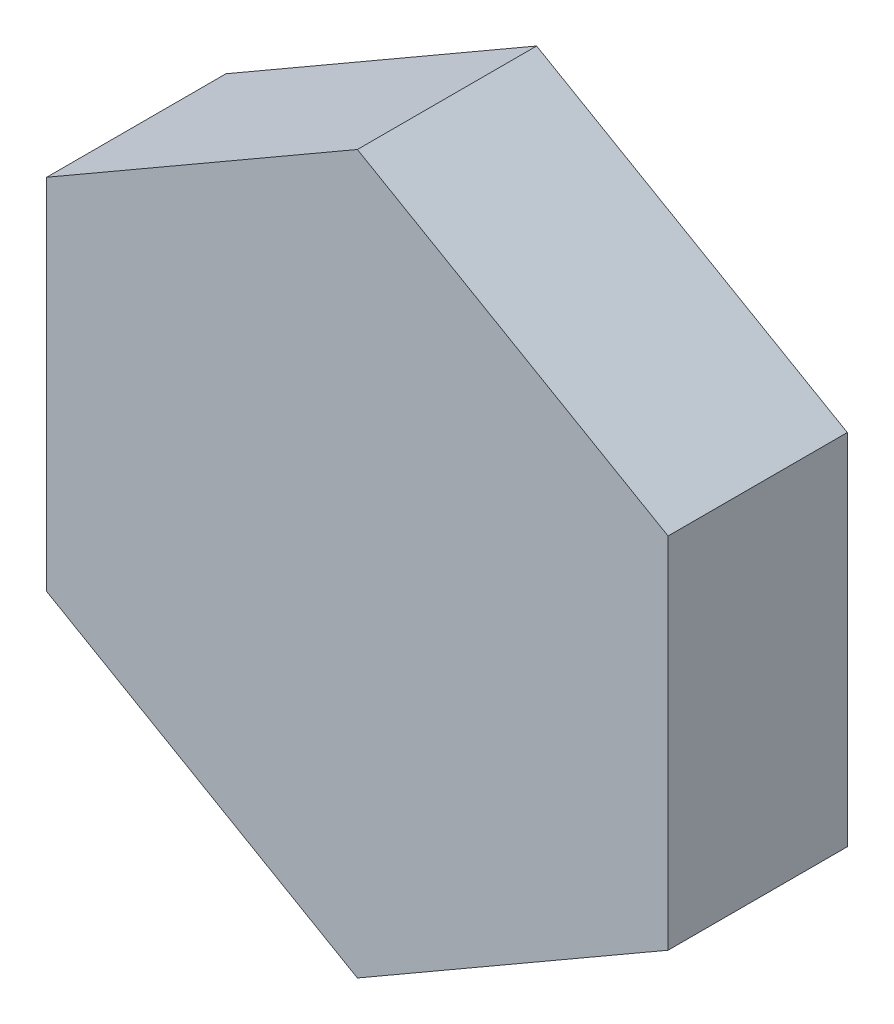
ISO-10303-21;
HEADER;
FILE_DESCRIPTION(('STEP AP214'),'2;1');
FILE_NAME('part.step','',(''),(''),'','','');
FILE_SCHEMA(('AUTOMOTIVE_DESIGN { 1 0 10303 214 1 1 1 1 }'));
ENDSEC;
DATA;
#1=APPLICATION_CONTEXT('core data for automotive mechanical design processes');
#2=APPLICATION_PROTOCOL_DEFINITION('international standard','automotive_design',2000,#1);
#3=PRODUCT_CONTEXT('',#1,'mechanical');
#4=PRODUCT('Part','Part','',(#3));
#5=PRODUCT_RELATED_PRODUCT_CATEGORY('part','',(#4));
#6=PRODUCT_DEFINITION_FORMATION('','',#4);
#7=PRODUCT_DEFINITION_CONTEXT('part definition',#1,'design');
#8=PRODUCT_DEFINITION('design','',#6,#7);
#9=PRODUCT_DEFINITION_SHAPE('','',#8);
#10=(LENGTH_UNIT() NAMED_UNIT(*) SI_UNIT(.MILLI.,.METRE.));
#11=(NAMED_UNIT(*) PLANE_ANGLE_UNIT() SI_UNIT($,.RADIAN.));
#12=(NAMED_UNIT(*) SI_UNIT($,.STERADIAN.) SOLID_ANGLE_UNIT());
#13=UNCERTAINTY_MEASURE_WITH_UNIT(LENGTH_MEASURE(1.E-05),#10,'distance_accuracy_value','');
#14=(GEOMETRIC_REPRESENTATION_CONTEXT(3) GLOBAL_UNCERTAINTY_ASSIGNED_CONTEXT((#13)) GLOBAL_UNIT_ASSIGNED_CONTEXT((#10,
#11,#12)) REPRESENTATION_CONTEXT('',''));
#15=CARTESIAN_POINT('',(0.,0.,0.));
#16=DIRECTION('',(0.,0.,1.));
#17=DIRECTION('',(1.,0.,0.));
#18=AXIS2_PLACEMENT_3D('',#15,#16,#17);
#19=CARTESIAN_POINT('',(-234.,-135.099962990372,135.));
#20=DIRECTION('',(0.5,0.866025403784439,0.));
#21=DIRECTION('',(-0.866025403784439,0.5,0.));
#22=AXIS2_PLACEMENT_3D('',#19,#20,#21);
#23=PLANE('',#22);
#24=DIRECTION('',(0.866025403784439,-0.5,0.));
#25=VECTOR('',#24,1.);
#26=CARTESIAN_POINT('',(-234.,-135.099962990372,0.));
#27=LINE('',#26,#25);
#28=CARTESIAN_POINT('',(-234.,-135.099962990372,0.));
#29=VERTEX_POINT('',#28);
#30=CARTESIAN_POINT('',(0.,-270.199925980745,0.));
#31=VERTEX_POINT('',#30);
#32=EDGE_CURVE('E126',#29,#31,#27,.T.);
#33=ORIENTED_EDGE('',*,*,#32,.T.);
#34=DIRECTION('',(0.,0.,-1.));
#35=VECTOR('',#34,1.);
#36=CARTESIAN_POINT('',(0.,-270.199925980745,135.));
#37=LINE('',#36,#35);
#38=CARTESIAN_POINT('',(0.,-270.199925980745,135.));
#39=VERTEX_POINT('',#38);
#40=EDGE_CURVE('E11',#39,#31,#37,.T.);
#41=ORIENTED_EDGE('',*,*,#40,.F.);
#42=DIRECTION('',(0.866025403784439,-0.5,0.));
#43=VECTOR('',#42,1.);
#44=CARTESIAN_POINT('',(-234.,-135.099962990372,135.));
#45=LINE('',#44,#43);
#46=CARTESIAN_POINT('',(-234.,-135.099962990372,135.));
#47=VERTEX_POINT('',#46);
#48=EDGE_CURVE('E136',#47,#39,#45,.T.);
#49=ORIENTED_EDGE('',*,*,#48,.F.);
#50=DIRECTION('',(0.,0.,-1.));
#51=VECTOR('',#50,1.);
#52=CARTESIAN_POINT('',(-234.,-135.099962990372,135.));
#53=LINE('',#52,#51);
#54=EDGE_CURVE('E122',#47,#29,#53,.T.);
#55=ORIENTED_EDGE('',*,*,#54,.T.);
#56=EDGE_LOOP('',(#33,#41,#49,#55));
#57=FACE_BOUND('',#56,.T.);
#58=ADVANCED_FACE('F42',(#57),#23,.F.);
#59=CARTESIAN_POINT('',(0.,-270.199925980745,135.));
#60=DIRECTION('',(-0.5,0.866025403784439,0.));
#61=DIRECTION('',(-0.866025403784439,-0.5,0.));
#62=AXIS2_PLACEMENT_3D('',#59,#60,#61);
#63=PLANE('',#62);
#64=DIRECTION('',(0.866025403784438,0.5,0.));
#65=VECTOR('',#64,1.);
#66=CARTESIAN_POINT('',(0.,-270.199925980745,0.));
#67=LINE('',#66,#65);
#68=CARTESIAN_POINT('',(234.,-135.099962990372,0.));
#69=VERTEX_POINT('',#68);
#70=EDGE_CURVE('E129',#31,#69,#67,.T.);
#71=ORIENTED_EDGE('',*,*,#70,.T.);
#72=DIRECTION('',(0.,0.,-1.));
#73=VECTOR('',#72,1.);
#74=CARTESIAN_POINT('',(234.,-135.099962990372,135.));
#75=LINE('',#74,#73);
#76=CARTESIAN_POINT('',(234.,-135.099962990372,135.));
#77=VERTEX_POINT('',#76);
#78=EDGE_CURVE('E50',#77,#69,#75,.T.);
#79=ORIENTED_EDGE('',*,*,#78,.F.);
#80=DIRECTION('',(0.866025403784438,0.5,0.));
#81=VECTOR('',#80,1.);
#82=CARTESIAN_POINT('',(0.,-270.199925980745,135.));
#83=LINE('',#82,#81);
#84=EDGE_CURVE('E95',#39,#77,#83,.T.);
#85=ORIENTED_EDGE('',*,*,#84,.F.);
#86=ORIENTED_EDGE('',*,*,#40,.T.);
#87=EDGE_LOOP('',(#71,#79,#85,#86));
#88=FACE_BOUND('',#87,.T.);
#89=ADVANCED_FACE('F160',(#88),#63,.F.);
#90=CARTESIAN_POINT('',(234.,-135.099962990372,135.));
#91=DIRECTION('',(-1.,0.,0.));
#92=DIRECTION('',(0.,-1.,0.));
#93=AXIS2_PLACEMENT_3D('',#90,#91,#92);
#94=PLANE('',#93);
#95=DIRECTION('',(0.,1.,0.));
#96=VECTOR('',#95,1.);
#97=CARTESIAN_POINT('',(234.,-135.099962990372,0.));
#98=LINE('',#97,#96);
#99=CARTESIAN_POINT('',(234.,135.099962990372,0.));
#100=VERTEX_POINT('',#99);
#101=EDGE_CURVE('E131',#69,#100,#98,.T.);
#102=ORIENTED_EDGE('',*,*,#101,.T.);
#103=DIRECTION('',(0.,0.,-1.));
#104=VECTOR('',#103,1.);
#105=CARTESIAN_POINT('',(234.,135.099962990372,135.));
#106=LINE('',#105,#104);
#107=CARTESIAN_POINT('',(234.,135.099962990372,135.));
#108=VERTEX_POINT('',#107);
#109=EDGE_CURVE('E117',#108,#100,#106,.T.);
#110=ORIENTED_EDGE('',*,*,#109,.F.);
#111=DIRECTION('',(0.,1.,0.));
#112=VECTOR('',#111,1.);
#113=CARTESIAN_POINT('',(234.,-135.099962990372,135.));
#114=LINE('',#113,#112);
#115=EDGE_CURVE('E108',#77,#108,#114,.T.);
#116=ORIENTED_EDGE('',*,*,#115,.F.);
#117=ORIENTED_EDGE('',*,*,#78,.T.);
#118=EDGE_LOOP('',(#102,#110,#116,#117));
#119=FACE_BOUND('',#118,.T.);
#120=ADVANCED_FACE('F142',(#119),#94,.F.);
#121=CARTESIAN_POINT('',(234.,135.099962990372,135.));
#122=DIRECTION('',(-0.5,-0.866025403784439,0.));
#123=DIRECTION('',(0.866025403784439,-0.5,0.));
#124=AXIS2_PLACEMENT_3D('',#121,#122,#123);
#125=PLANE('',#124);
#126=DIRECTION('',(-0.866025403784439,0.5,0.));
#127=VECTOR('',#126,1.);
#128=CARTESIAN_POINT('',(234.,135.099962990372,0.));
#129=LINE('',#128,#127);
#130=CARTESIAN_POINT('',(0.,270.199925980745,0.));
#131=VERTEX_POINT('',#130);
#132=EDGE_CURVE('E116',#100,#131,#129,.T.);
#133=ORIENTED_EDGE('',*,*,#132,.T.);
#134=DIRECTION('',(0.,0.,-1.));
#135=VECTOR('',#134,1.);
#136=CARTESIAN_POINT('',(0.,270.199925980745,135.));
#137=LINE('',#136,#135);
#138=CARTESIAN_POINT('',(0.,270.199925980745,135.));
#139=VERTEX_POINT('',#138);
#140=EDGE_CURVE('E113',#139,#131,#137,.T.);
#141=ORIENTED_EDGE('',*,*,#140,.F.);
#142=DIRECTION('',(-0.866025403784439,0.5,0.));
#143=VECTOR('',#142,1.);
#144=CARTESIAN_POINT('',(234.,135.099962990372,135.));
#145=LINE('',#144,#143);
#146=EDGE_CURVE('E102',#108,#139,#145,.T.);
#147=ORIENTED_EDGE('',*,*,#146,.F.);
#148=ORIENTED_EDGE('',*,*,#109,.T.);
#149=EDGE_LOOP('',(#133,#141,#147,#148));
#150=FACE_BOUND('',#149,.T.);
#151=ADVANCED_FACE('F114',(#150),#125,.F.);
#152=CARTESIAN_POINT('',(0.,270.199925980745,135.));
#153=DIRECTION('',(0.5,-0.866025403784439,0.));
#154=DIRECTION('',(0.866025403784439,0.5,0.));
#155=AXIS2_PLACEMENT_3D('',#152,#153,#154);
#156=PLANE('',#155);
#157=DIRECTION('',(-0.866025403784438,-0.5,0.));
#158=VECTOR('',#157,1.);
#159=CARTESIAN_POINT('',(0.,270.199925980745,0.));
#160=LINE('',#159,#158);
#161=CARTESIAN_POINT('',(-234.,135.099962990372,0.));
#162=VERTEX_POINT('',#161);
#163=EDGE_CURVE('E81',#131,#162,#160,.T.);
#164=ORIENTED_EDGE('',*,*,#163,.T.);
#165=DIRECTION('',(0.,0.,-1.));
#166=VECTOR('',#165,1.);
#167=CARTESIAN_POINT('',(-234.,135.099962990372,135.));
#168=LINE('',#167,#166);
#169=CARTESIAN_POINT('',(-234.,135.099962990372,135.));
#170=VERTEX_POINT('',#169);
#171=EDGE_CURVE('E118',#170,#162,#168,.T.);
#172=ORIENTED_EDGE('',*,*,#171,.F.);
#173=DIRECTION('',(-0.866025403784438,-0.5,0.));
#174=VECTOR('',#173,1.);
#175=CARTESIAN_POINT('',(0.,270.199925980745,135.));
#176=LINE('',#175,#174);
#177=EDGE_CURVE('E106',#139,#170,#176,.T.);
#178=ORIENTED_EDGE('',*,*,#177,.F.);
#179=ORIENTED_EDGE('',*,*,#140,.T.);
#180=EDGE_LOOP('',(#164,#172,#178,#179));
#181=FACE_BOUND('',#180,.T.);
#182=ADVANCED_FACE('F120',(#181),#156,.F.);
#183=CARTESIAN_POINT('',(-234.,135.099962990372,135.));
#184=DIRECTION('',(1.,0.,0.));
#185=DIRECTION('',(0.,0.,-1.));
#186=AXIS2_PLACEMENT_3D('',#183,#184,#185);
#187=PLANE('',#186);
#188=DIRECTION('',(0.,-1.,0.));
#189=VECTOR('',#188,1.);
#190=CARTESIAN_POINT('',(-234.,135.099962990372,0.));
#191=LINE('',#190,#189);
#192=EDGE_CURVE('E87',#162,#29,#191,.T.);
#193=ORIENTED_EDGE('',*,*,#192,.T.);
#194=ORIENTED_EDGE('',*,*,#54,.F.);
#195=DIRECTION('',(0.,-1.,0.));
#196=VECTOR('',#195,1.);
#197=CARTESIAN_POINT('',(-234.,135.099962990372,135.));
#198=LINE('',#197,#196);
#199=EDGE_CURVE('E58',#170,#47,#198,.T.);
#200=ORIENTED_EDGE('',*,*,#199,.F.);
#201=ORIENTED_EDGE('',*,*,#171,.T.);
#202=EDGE_LOOP('',(#193,#194,#200,#201));
#203=FACE_BOUND('',#202,.T.);
#204=ADVANCED_FACE('F149',(#203),#187,.F.);
#205=CARTESIAN_POINT('',(0.,0.,135.));
#206=DIRECTION('',(0.,0.,1.));
#207=DIRECTION('',(1.,0.,0.));
#208=AXIS2_PLACEMENT_3D('',#205,#206,#207);
#209=PLANE('',#208);
#210=ORIENTED_EDGE('',*,*,#48,.T.);
#211=ORIENTED_EDGE('',*,*,#84,.T.);
#212=ORIENTED_EDGE('',*,*,#115,.T.);
#213=ORIENTED_EDGE('',*,*,#146,.T.);
#214=ORIENTED_EDGE('',*,*,#177,.T.);
#215=ORIENTED_EDGE('',*,*,#199,.T.);
#216=EDGE_LOOP('',(#210,#211,#212,#213,#214,#215));
#217=FACE_BOUND('',#216,.T.);
#218=ADVANCED_FACE('F104',(#217),#209,.T.);
#219=CARTESIAN_POINT('',(0.,0.,0.));
#220=DIRECTION('',(0.,0.,1.));
#221=DIRECTION('',(1.,0.,0.));
#222=AXIS2_PLACEMENT_3D('',#219,#220,#221);
#223=PLANE('',#222);
#224=ORIENTED_EDGE('',*,*,#32,.F.);
#225=ORIENTED_EDGE('',*,*,#192,.F.);
#226=ORIENTED_EDGE('',*,*,#163,.F.);
#227=ORIENTED_EDGE('',*,*,#132,.F.);
#228=ORIENTED_EDGE('',*,*,#101,.F.);
#229=ORIENTED_EDGE('',*,*,#70,.F.);
#230=EDGE_LOOP('',(#224,#225,#226,#227,#228,#229));
#231=FACE_BOUND('',#230,.T.);
#232=ADVANCED_FACE('F145',(#231),#223,.F.);
#233=CLOSED_SHELL('',(#58,#89,#120,#151,#182,#204,#218,#232));
#234=MANIFOLD_SOLID_BREP('B2',#233);
#235=ADVANCED_BREP_SHAPE_REPRESENTATION('',(#18,#234),#14);
#236=SHAPE_DEFINITION_REPRESENTATION(#9,#235);
ENDSEC;
END-ISO-10303-21;
